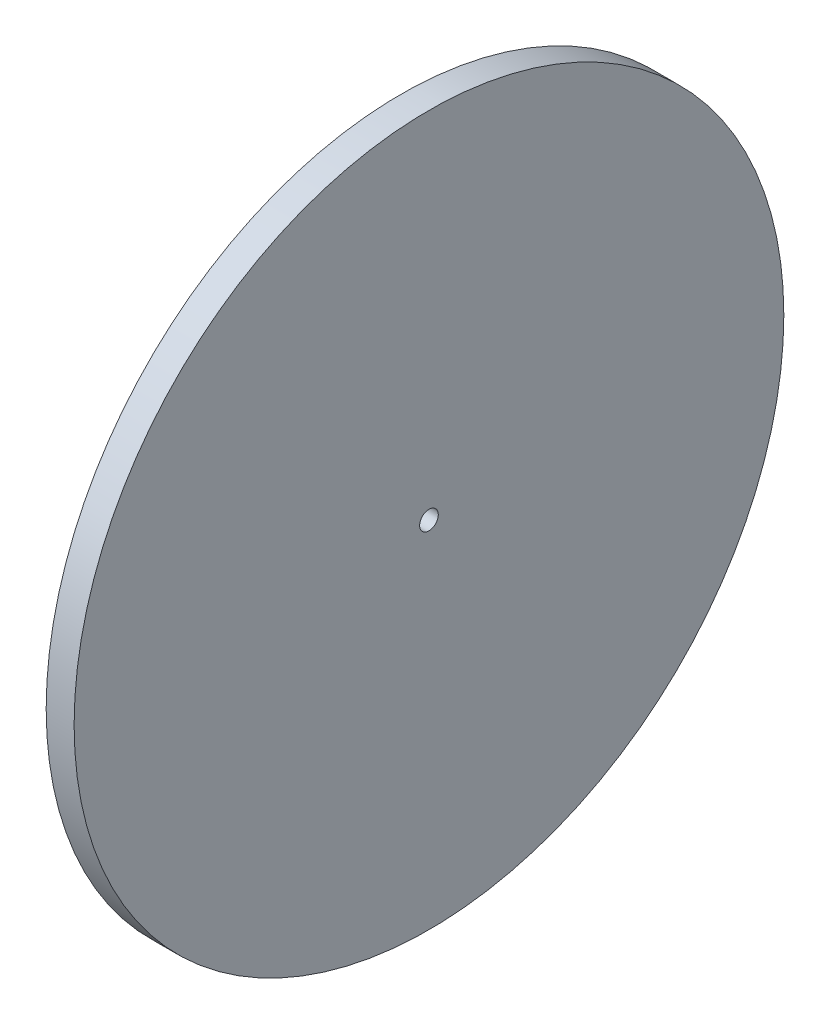
ISO-10303-21;
HEADER;
FILE_DESCRIPTION(('STEP AP214'),'2;1');
FILE_NAME('part.step','',(''),(''),'','','');
FILE_SCHEMA(('AUTOMOTIVE_DESIGN { 1 0 10303 214 1 1 1 1 }'));
ENDSEC;
DATA;
#1=APPLICATION_CONTEXT('core data for automotive mechanical design processes');
#2=APPLICATION_PROTOCOL_DEFINITION('international standard','automotive_design',2000,#1);
#3=PRODUCT_CONTEXT('',#1,'mechanical');
#4=PRODUCT('Part','Part','',(#3));
#5=PRODUCT_RELATED_PRODUCT_CATEGORY('part','',(#4));
#6=PRODUCT_DEFINITION_FORMATION('','',#4);
#7=PRODUCT_DEFINITION_CONTEXT('part definition',#1,'design');
#8=PRODUCT_DEFINITION('design','',#6,#7);
#9=PRODUCT_DEFINITION_SHAPE('','',#8);
#10=(LENGTH_UNIT() NAMED_UNIT(*) SI_UNIT(.MILLI.,.METRE.));
#11=(NAMED_UNIT(*) PLANE_ANGLE_UNIT() SI_UNIT($,.RADIAN.));
#12=(NAMED_UNIT(*) SI_UNIT($,.STERADIAN.) SOLID_ANGLE_UNIT());
#13=UNCERTAINTY_MEASURE_WITH_UNIT(LENGTH_MEASURE(1.E-05),#10,'distance_accuracy_value','');
#14=(GEOMETRIC_REPRESENTATION_CONTEXT(3) GLOBAL_UNCERTAINTY_ASSIGNED_CONTEXT((#13)) GLOBAL_UNIT_ASSIGNED_CONTEXT((#10,
#11,#12)) REPRESENTATION_CONTEXT('',''));
#15=CARTESIAN_POINT('',(0.,0.,0.));
#16=DIRECTION('',(0.,0.,1.));
#17=DIRECTION('',(1.,0.,0.));
#18=AXIS2_PLACEMENT_3D('',#15,#16,#17);
#19=CARTESIAN_POINT('',(0.,2.,0.));
#20=DIRECTION('',(1.,0.,0.));
#21=DIRECTION('',(0.,0.,-1.));
#22=AXIS2_PLACEMENT_3D('',#19,#20,#21);
#23=PLANE('',#22);
#24=CARTESIAN_POINT('',(0.,0.,0.));
#25=DIRECTION('',(-1.,0.,0.));
#26=DIRECTION('',(0.,0.,1.));
#27=AXIS2_PLACEMENT_3D('',#24,#25,#26);
#28=CIRCLE('',#27,2.);
#29=CARTESIAN_POINT('',(0.,0.,2.));
#30=VERTEX_POINT('',#29);
#31=EDGE_CURVE('E10',#30,#30,#28,.T.);
#32=ORIENTED_EDGE('',*,*,#31,.F.);
#33=EDGE_LOOP('',(#32));
#34=FACE_BOUND('',#33,.T.);
#35=CARTESIAN_POINT('',(0.,0.,0.));
#36=DIRECTION('',(-1.,0.,0.));
#37=DIRECTION('',(0.,0.,1.));
#38=AXIS2_PLACEMENT_3D('',#35,#36,#37);
#39=CIRCLE('',#38,57.);
#40=CARTESIAN_POINT('',(0.,0.,57.));
#41=VERTEX_POINT('',#40);
#42=EDGE_CURVE('E64',#41,#41,#39,.T.);
#43=ORIENTED_EDGE('',*,*,#42,.T.);
#44=EDGE_LOOP('',(#43));
#45=FACE_BOUND('',#44,.T.);
#46=ADVANCED_FACE('F33',(#34,#45),#23,.F.);
#47=CARTESIAN_POINT('',(0.,0.,0.));
#48=DIRECTION('',(-1.,0.,0.));
#49=DIRECTION('',(0.,0.,1.));
#50=AXIS2_PLACEMENT_3D('',#47,#48,#49);
#51=CYLINDRICAL_SURFACE('',#50,2.);
#52=CARTESIAN_POINT('',(3.,0.,0.));
#53=DIRECTION('',(-1.,0.,0.));
#54=DIRECTION('',(0.,0.,1.));
#55=AXIS2_PLACEMENT_3D('',#52,#53,#54);
#56=CIRCLE('',#55,2.);
#57=CARTESIAN_POINT('',(3.,0.,2.));
#58=VERTEX_POINT('',#57);
#59=EDGE_CURVE('E39',#58,#58,#56,.T.);
#60=ORIENTED_EDGE('',*,*,#59,.F.);
#61=EDGE_LOOP('',(#60));
#62=FACE_BOUND('',#61,.T.);
#63=ORIENTED_EDGE('',*,*,#31,.T.);
#64=EDGE_LOOP('',(#63));
#65=FACE_BOUND('',#64,.T.);
#66=ADVANCED_FACE('F107',(#62,#65),#51,.F.);
#67=CARTESIAN_POINT('',(3.,2.,0.));
#68=DIRECTION('',(-1.,0.,0.));
#69=DIRECTION('',(0.,0.,1.));
#70=AXIS2_PLACEMENT_3D('',#67,#68,#69);
#71=PLANE('',#70);
#72=CARTESIAN_POINT('',(3.,0.,0.));
#73=DIRECTION('',(-1.,0.,0.));
#74=DIRECTION('',(0.,0.,1.));
#75=AXIS2_PLACEMENT_3D('',#72,#73,#74);
#76=CIRCLE('',#75,76.2);
#77=CARTESIAN_POINT('',(3.,0.,76.2));
#78=VERTEX_POINT('',#77);
#79=EDGE_CURVE('E43',#78,#78,#76,.T.);
#80=ORIENTED_EDGE('',*,*,#79,.F.);
#81=EDGE_LOOP('',(#80));
#82=FACE_BOUND('',#81,.T.);
#83=ORIENTED_EDGE('',*,*,#59,.T.);
#84=EDGE_LOOP('',(#83));
#85=FACE_BOUND('',#84,.T.);
#86=ADVANCED_FACE('F102',(#82,#85),#71,.F.);
#87=CARTESIAN_POINT('',(0.,0.,0.));
#88=DIRECTION('',(-1.,0.,0.));
#89=DIRECTION('',(0.,0.,1.));
#90=AXIS2_PLACEMENT_3D('',#87,#88,#89);
#91=CYLINDRICAL_SURFACE('',#90,76.2);
#92=CARTESIAN_POINT('',(-3.,0.,0.));
#93=DIRECTION('',(-1.,0.,0.));
#94=DIRECTION('',(0.,0.,1.));
#95=AXIS2_PLACEMENT_3D('',#92,#93,#94);
#96=CIRCLE('',#95,76.2);
#97=CARTESIAN_POINT('',(-3.,0.,76.2));
#98=VERTEX_POINT('',#97);
#99=EDGE_CURVE('E47',#98,#98,#96,.T.);
#100=ORIENTED_EDGE('',*,*,#99,.F.);
#101=EDGE_LOOP('',(#100));
#102=FACE_BOUND('',#101,.T.);
#103=ORIENTED_EDGE('',*,*,#79,.T.);
#104=EDGE_LOOP('',(#103));
#105=FACE_BOUND('',#104,.T.);
#106=ADVANCED_FACE('F96',(#102,#105),#91,.T.);
#107=CARTESIAN_POINT('',(-3.,76.2,0.));
#108=DIRECTION('',(1.,0.,0.));
#109=DIRECTION('',(0.,0.,-1.));
#110=AXIS2_PLACEMENT_3D('',#107,#108,#109);
#111=PLANE('',#110);
#112=CARTESIAN_POINT('',(-3.,0.,0.));
#113=DIRECTION('',(-1.,0.,0.));
#114=DIRECTION('',(0.,0.,1.));
#115=AXIS2_PLACEMENT_3D('',#112,#113,#114);
#116=CIRCLE('',#115,62.);
#117=CARTESIAN_POINT('',(-3.,0.,62.));
#118=VERTEX_POINT('',#117);
#119=EDGE_CURVE('E52',#118,#118,#116,.T.);
#120=ORIENTED_EDGE('',*,*,#119,.F.);
#121=EDGE_LOOP('',(#120));
#122=FACE_BOUND('',#121,.T.);
#123=ORIENTED_EDGE('',*,*,#99,.T.);
#124=EDGE_LOOP('',(#123));
#125=FACE_BOUND('',#124,.T.);
#126=ADVANCED_FACE('F90',(#122,#125),#111,.F.);
#127=CARTESIAN_POINT('',(-5.,0.,0.));
#128=DIRECTION('',(-1.,0.,0.));
#129=DIRECTION('',(0.,0.,1.));
#130=AXIS2_PLACEMENT_3D('',#127,#128,#129);
#131=TOROIDAL_SURFACE('',#130,62.,2.);
#132=CARTESIAN_POINT('',(-5.,0.,0.));
#133=DIRECTION('',(-1.,0.,0.));
#134=DIRECTION('',(0.,0.,1.));
#135=AXIS2_PLACEMENT_3D('',#132,#133,#134);
#136=CIRCLE('',#135,60.);
#137=CARTESIAN_POINT('',(-5.,0.,60.));
#138=VERTEX_POINT('',#137);
#139=EDGE_CURVE('E55',#138,#138,#136,.T.);
#140=ORIENTED_EDGE('',*,*,#139,.F.);
#141=EDGE_LOOP('',(#140));
#142=FACE_BOUND('',#141,.T.);
#143=ORIENTED_EDGE('',*,*,#119,.T.);
#144=EDGE_LOOP('',(#143));
#145=FACE_BOUND('',#144,.T.);
#146=ADVANCED_FACE('F84',(#142,#145),#131,.F.);
#147=CARTESIAN_POINT('',(0.,0.,0.));
#148=DIRECTION('',(-1.,0.,0.));
#149=DIRECTION('',(0.,0.,1.));
#150=AXIS2_PLACEMENT_3D('',#147,#148,#149);
#151=CYLINDRICAL_SURFACE('',#150,60.);
#152=CARTESIAN_POINT('',(-12.,0.,0.));
#153=DIRECTION('',(-1.,0.,0.));
#154=DIRECTION('',(0.,0.,1.));
#155=AXIS2_PLACEMENT_3D('',#152,#153,#154);
#156=CIRCLE('',#155,60.);
#157=CARTESIAN_POINT('',(-12.,0.,60.));
#158=VERTEX_POINT('',#157);
#159=EDGE_CURVE('E58',#158,#158,#156,.T.);
#160=ORIENTED_EDGE('',*,*,#159,.F.);
#161=EDGE_LOOP('',(#160));
#162=FACE_BOUND('',#161,.T.);
#163=ORIENTED_EDGE('',*,*,#139,.T.);
#164=EDGE_LOOP('',(#163));
#165=FACE_BOUND('',#164,.T.);
#166=ADVANCED_FACE('F78',(#162,#165),#151,.T.);
#167=CARTESIAN_POINT('',(-12.,60.,0.));
#168=DIRECTION('',(1.,0.,0.));
#169=DIRECTION('',(0.,0.,-1.));
#170=AXIS2_PLACEMENT_3D('',#167,#168,#169);
#171=PLANE('',#170);
#172=CARTESIAN_POINT('',(-12.,0.,0.));
#173=DIRECTION('',(-1.,0.,0.));
#174=DIRECTION('',(0.,0.,1.));
#175=AXIS2_PLACEMENT_3D('',#172,#173,#174);
#176=CIRCLE('',#175,57.);
#177=CARTESIAN_POINT('',(-12.,0.,57.));
#178=VERTEX_POINT('',#177);
#179=EDGE_CURVE('E61',#178,#178,#176,.T.);
#180=ORIENTED_EDGE('',*,*,#179,.F.);
#181=EDGE_LOOP('',(#180));
#182=FACE_BOUND('',#181,.T.);
#183=ORIENTED_EDGE('',*,*,#159,.T.);
#184=EDGE_LOOP('',(#183));
#185=FACE_BOUND('',#184,.T.);
#186=ADVANCED_FACE('F72',(#182,#185),#171,.F.);
#187=CARTESIAN_POINT('',(0.,0.,0.));
#188=DIRECTION('',(-1.,0.,0.));
#189=DIRECTION('',(0.,0.,1.));
#190=AXIS2_PLACEMENT_3D('',#187,#188,#189);
#191=CYLINDRICAL_SURFACE('',#190,57.);
#192=ORIENTED_EDGE('',*,*,#42,.F.);
#193=EDGE_LOOP('',(#192));
#194=FACE_BOUND('',#193,.T.);
#195=ORIENTED_EDGE('',*,*,#179,.T.);
#196=EDGE_LOOP('',(#195));
#197=FACE_BOUND('',#196,.T.);
#198=ADVANCED_FACE('F69',(#194,#197),#191,.F.);
#199=CLOSED_SHELL('',(#46,#66,#86,#106,#126,#146,#166,#186,#198));
#200=MANIFOLD_SOLID_BREP('B2',#199);
#201=ADVANCED_BREP_SHAPE_REPRESENTATION('',(#18,#200),#14);
#202=SHAPE_DEFINITION_REPRESENTATION(#9,#201);
ENDSEC;
END-ISO-10303-21;
